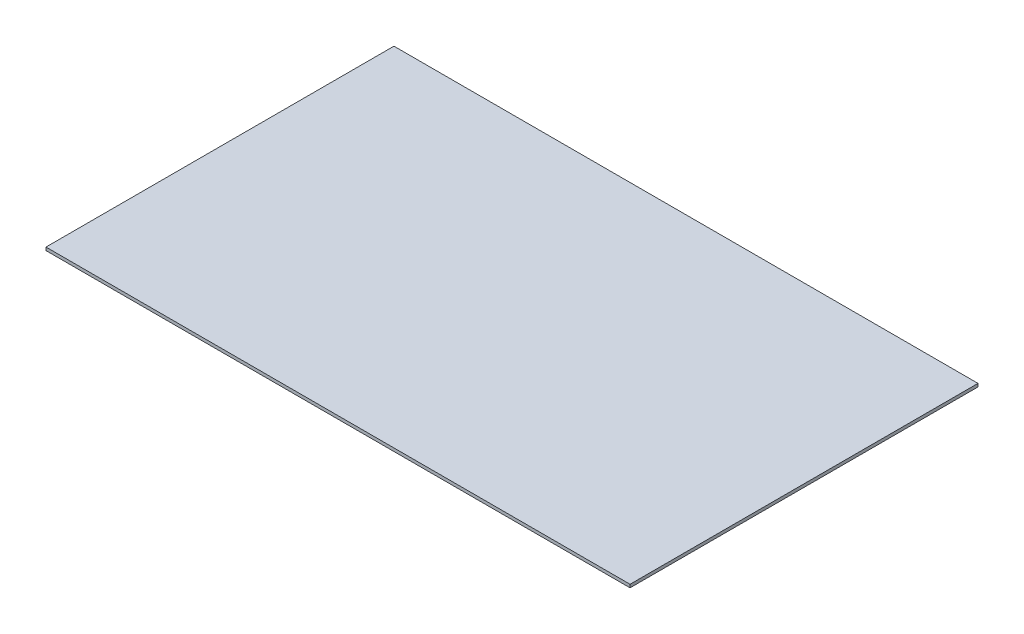
ISO-10303-21;
HEADER;
FILE_DESCRIPTION(('STEP AP214'),'2;1');
FILE_NAME('part.step','',(''),(''),'','','');
FILE_SCHEMA(('AUTOMOTIVE_DESIGN { 1 0 10303 214 1 1 1 1 }'));
ENDSEC;
DATA;
#1=APPLICATION_CONTEXT('core data for automotive mechanical design processes');
#2=APPLICATION_PROTOCOL_DEFINITION('international standard','automotive_design',2000,#1);
#3=PRODUCT_CONTEXT('',#1,'mechanical');
#4=PRODUCT('Part','Part','',(#3));
#5=PRODUCT_RELATED_PRODUCT_CATEGORY('part','',(#4));
#6=PRODUCT_DEFINITION_FORMATION('','',#4);
#7=PRODUCT_DEFINITION_CONTEXT('part definition',#1,'design');
#8=PRODUCT_DEFINITION('design','',#6,#7);
#9=PRODUCT_DEFINITION_SHAPE('','',#8);
#10=(LENGTH_UNIT() NAMED_UNIT(*) SI_UNIT(.MILLI.,.METRE.));
#11=(NAMED_UNIT(*) PLANE_ANGLE_UNIT() SI_UNIT($,.RADIAN.));
#12=(NAMED_UNIT(*) SI_UNIT($,.STERADIAN.) SOLID_ANGLE_UNIT());
#13=UNCERTAINTY_MEASURE_WITH_UNIT(LENGTH_MEASURE(1.E-05),#10,'distance_accuracy_value','');
#14=(GEOMETRIC_REPRESENTATION_CONTEXT(3) GLOBAL_UNCERTAINTY_ASSIGNED_CONTEXT((#13)) GLOBAL_UNIT_ASSIGNED_CONTEXT((#10,
#11,#12)) REPRESENTATION_CONTEXT('',''));
#15=CARTESIAN_POINT('',(0.,0.,0.));
#16=DIRECTION('',(0.,0.,1.));
#17=DIRECTION('',(1.,0.,0.));
#18=AXIS2_PLACEMENT_3D('',#15,#16,#17);
#19=CARTESIAN_POINT('',(0.,3.175,0.));
#20=DIRECTION('',(1.,0.,0.));
#21=DIRECTION('',(0.,0.,-1.));
#22=AXIS2_PLACEMENT_3D('',#19,#20,#21);
#23=PLANE('',#22);
#24=DIRECTION('',(0.,0.,1.));
#25=VECTOR('',#24,1.);
#26=CARTESIAN_POINT('',(0.,0.,0.));
#27=LINE('',#26,#25);
#28=CARTESIAN_POINT('',(0.,0.,0.));
#29=VERTEX_POINT('',#28);
#30=CARTESIAN_POINT('',(0.,0.,355.6));
#31=VERTEX_POINT('',#30);
#32=EDGE_CURVE('E96',#29,#31,#27,.T.);
#33=ORIENTED_EDGE('',*,*,#32,.T.);
#34=DIRECTION('',(0.,-1.,0.));
#35=VECTOR('',#34,1.);
#36=CARTESIAN_POINT('',(0.,3.175,355.6));
#37=LINE('',#36,#35);
#38=CARTESIAN_POINT('',(0.,3.175,355.6));
#39=VERTEX_POINT('',#38);
#40=EDGE_CURVE('E11',#39,#31,#37,.T.);
#41=ORIENTED_EDGE('',*,*,#40,.F.);
#42=DIRECTION('',(0.,0.,1.));
#43=VECTOR('',#42,1.);
#44=CARTESIAN_POINT('',(0.,3.175,0.));
#45=LINE('',#44,#43);
#46=CARTESIAN_POINT('',(0.,3.175,0.));
#47=VERTEX_POINT('',#46);
#48=EDGE_CURVE('E84',#47,#39,#45,.T.);
#49=ORIENTED_EDGE('',*,*,#48,.F.);
#50=DIRECTION('',(0.,-1.,0.));
#51=VECTOR('',#50,1.);
#52=CARTESIAN_POINT('',(0.,3.175,0.));
#53=LINE('',#52,#51);
#54=EDGE_CURVE('E92',#47,#29,#53,.T.);
#55=ORIENTED_EDGE('',*,*,#54,.T.);
#56=EDGE_LOOP('',(#33,#41,#49,#55));
#57=FACE_BOUND('',#56,.T.);
#58=ADVANCED_FACE('F33',(#57),#23,.F.);
#59=CARTESIAN_POINT('',(0.,3.175,355.6));
#60=DIRECTION('',(0.,0.,-1.));
#61=DIRECTION('',(-1.,0.,0.));
#62=AXIS2_PLACEMENT_3D('',#59,#60,#61);
#63=PLANE('',#62);
#64=DIRECTION('',(1.,0.,0.));
#65=VECTOR('',#64,1.);
#66=CARTESIAN_POINT('',(0.,0.,355.6));
#67=LINE('',#66,#65);
#68=CARTESIAN_POINT('',(596.9,0.,355.6));
#69=VERTEX_POINT('',#68);
#70=EDGE_CURVE('E88',#31,#69,#67,.T.);
#71=ORIENTED_EDGE('',*,*,#70,.T.);
#72=DIRECTION('',(0.,-1.,0.));
#73=VECTOR('',#72,1.);
#74=CARTESIAN_POINT('',(596.9,3.175,355.6));
#75=LINE('',#74,#73);
#76=CARTESIAN_POINT('',(596.9,3.175,355.6));
#77=VERTEX_POINT('',#76);
#78=EDGE_CURVE('E41',#77,#69,#75,.T.);
#79=ORIENTED_EDGE('',*,*,#78,.F.);
#80=DIRECTION('',(1.,0.,0.));
#81=VECTOR('',#80,1.);
#82=CARTESIAN_POINT('',(0.,3.175,355.6));
#83=LINE('',#82,#81);
#84=EDGE_CURVE('E79',#39,#77,#83,.T.);
#85=ORIENTED_EDGE('',*,*,#84,.F.);
#86=ORIENTED_EDGE('',*,*,#40,.T.);
#87=EDGE_LOOP('',(#71,#79,#85,#86));
#88=FACE_BOUND('',#87,.T.);
#89=ADVANCED_FACE('F87',(#88),#63,.F.);
#90=CARTESIAN_POINT('',(596.9,3.175,0.));
#91=DIRECTION('',(-1.,0.,0.));
#92=DIRECTION('',(0.,0.,1.));
#93=AXIS2_PLACEMENT_3D('',#90,#91,#92);
#94=PLANE('',#93);
#95=DIRECTION('',(0.,0.,-1.));
#96=VECTOR('',#95,1.);
#97=CARTESIAN_POINT('',(596.9,0.,0.));
#98=LINE('',#97,#96);
#99=CARTESIAN_POINT('',(596.9,0.,0.));
#100=VERTEX_POINT('',#99);
#101=EDGE_CURVE('E66',#69,#100,#98,.T.);
#102=ORIENTED_EDGE('',*,*,#101,.T.);
#103=DIRECTION('',(0.,-1.,0.));
#104=VECTOR('',#103,1.);
#105=CARTESIAN_POINT('',(596.9,3.175,0.));
#106=LINE('',#105,#104);
#107=CARTESIAN_POINT('',(596.9,3.175,0.));
#108=VERTEX_POINT('',#107);
#109=EDGE_CURVE('E89',#108,#100,#106,.T.);
#110=ORIENTED_EDGE('',*,*,#109,.F.);
#111=DIRECTION('',(0.,0.,-1.));
#112=VECTOR('',#111,1.);
#113=CARTESIAN_POINT('',(596.9,3.175,0.));
#114=LINE('',#113,#112);
#115=EDGE_CURVE('E82',#77,#108,#114,.T.);
#116=ORIENTED_EDGE('',*,*,#115,.F.);
#117=ORIENTED_EDGE('',*,*,#78,.T.);
#118=EDGE_LOOP('',(#102,#110,#116,#117));
#119=FACE_BOUND('',#118,.T.);
#120=ADVANCED_FACE('F90',(#119),#94,.F.);
#121=CARTESIAN_POINT('',(0.,3.175,0.));
#122=DIRECTION('',(0.,0.,1.));
#123=DIRECTION('',(1.,0.,0.));
#124=AXIS2_PLACEMENT_3D('',#121,#122,#123);
#125=PLANE('',#124);
#126=DIRECTION('',(-1.,0.,0.));
#127=VECTOR('',#126,1.);
#128=CARTESIAN_POINT('',(0.,0.,0.));
#129=LINE('',#128,#127);
#130=EDGE_CURVE('E72',#100,#29,#129,.T.);
#131=ORIENTED_EDGE('',*,*,#130,.T.);
#132=ORIENTED_EDGE('',*,*,#54,.F.);
#133=DIRECTION('',(-1.,0.,0.));
#134=VECTOR('',#133,1.);
#135=CARTESIAN_POINT('',(0.,3.175,0.));
#136=LINE('',#135,#134);
#137=EDGE_CURVE('E49',#108,#47,#136,.T.);
#138=ORIENTED_EDGE('',*,*,#137,.F.);
#139=ORIENTED_EDGE('',*,*,#109,.T.);
#140=EDGE_LOOP('',(#131,#132,#138,#139));
#141=FACE_BOUND('',#140,.T.);
#142=ADVANCED_FACE('F103',(#141),#125,.F.);
#143=CARTESIAN_POINT('',(0.,3.175,0.));
#144=DIRECTION('',(0.,1.,0.));
#145=DIRECTION('',(0.,0.,1.));
#146=AXIS2_PLACEMENT_3D('',#143,#144,#145);
#147=PLANE('',#146);
#148=ORIENTED_EDGE('',*,*,#48,.T.);
#149=ORIENTED_EDGE('',*,*,#84,.T.);
#150=ORIENTED_EDGE('',*,*,#115,.T.);
#151=ORIENTED_EDGE('',*,*,#137,.T.);
#152=EDGE_LOOP('',(#148,#149,#150,#151));
#153=FACE_BOUND('',#152,.T.);
#154=ADVANCED_FACE('F80',(#153),#147,.T.);
#155=CARTESIAN_POINT('',(0.,0.,0.));
#156=DIRECTION('',(0.,1.,0.));
#157=DIRECTION('',(0.,0.,1.));
#158=AXIS2_PLACEMENT_3D('',#155,#156,#157);
#159=PLANE('',#158);
#160=ORIENTED_EDGE('',*,*,#32,.F.);
#161=ORIENTED_EDGE('',*,*,#130,.F.);
#162=ORIENTED_EDGE('',*,*,#101,.F.);
#163=ORIENTED_EDGE('',*,*,#70,.F.);
#164=EDGE_LOOP('',(#160,#161,#162,#163));
#165=FACE_BOUND('',#164,.T.);
#166=ADVANCED_FACE('F106',(#165),#159,.F.);
#167=CLOSED_SHELL('',(#58,#89,#120,#142,#154,#166));
#168=MANIFOLD_SOLID_BREP('B2',#167);
#169=ADVANCED_BREP_SHAPE_REPRESENTATION('',(#18,#168),#14);
#170=SHAPE_DEFINITION_REPRESENTATION(#9,#169);
ENDSEC;
END-ISO-10303-21;
